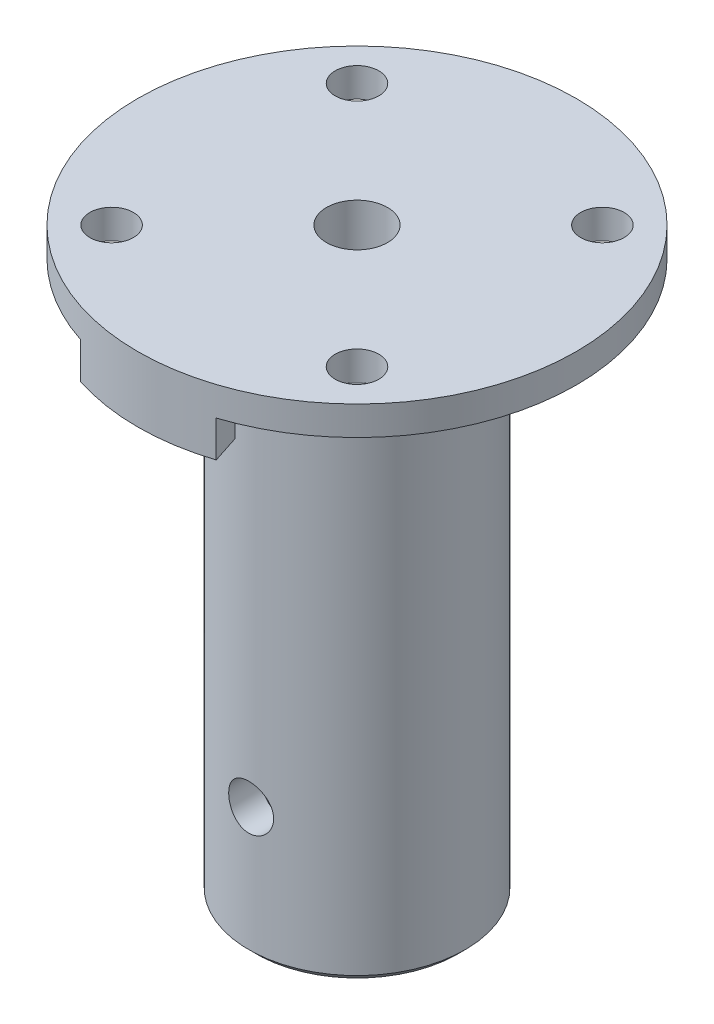
ISO-10303-21;
HEADER;
FILE_DESCRIPTION(('STEP AP214'),'2;1');
FILE_NAME('part.step','',(''),(''),'','','');
FILE_SCHEMA(('AUTOMOTIVE_DESIGN { 1 0 10303 214 1 1 1 1 }'));
ENDSEC;
DATA;
#1=APPLICATION_CONTEXT('core data for automotive mechanical design processes');
#2=APPLICATION_PROTOCOL_DEFINITION('international standard','automotive_design',2000,#1);
#3=PRODUCT_CONTEXT('',#1,'mechanical');
#4=PRODUCT('Part','Part','',(#3));
#5=PRODUCT_RELATED_PRODUCT_CATEGORY('part','',(#4));
#6=PRODUCT_DEFINITION_FORMATION('','',#4);
#7=PRODUCT_DEFINITION_CONTEXT('part definition',#1,'design');
#8=PRODUCT_DEFINITION('design','',#6,#7);
#9=PRODUCT_DEFINITION_SHAPE('','',#8);
#10=(LENGTH_UNIT() NAMED_UNIT(*) SI_UNIT(.MILLI.,.METRE.));
#11=(NAMED_UNIT(*) PLANE_ANGLE_UNIT() SI_UNIT($,.RADIAN.));
#12=(NAMED_UNIT(*) SI_UNIT($,.STERADIAN.) SOLID_ANGLE_UNIT());
#13=UNCERTAINTY_MEASURE_WITH_UNIT(LENGTH_MEASURE(1.E-05),#10,'distance_accuracy_value','');
#14=(GEOMETRIC_REPRESENTATION_CONTEXT(3) GLOBAL_UNCERTAINTY_ASSIGNED_CONTEXT((#13)) GLOBAL_UNIT_ASSIGNED_CONTEXT((#10,
#11,#12)) REPRESENTATION_CONTEXT('',''));
#15=CARTESIAN_POINT('',(0.,0.,0.));
#16=DIRECTION('',(0.,0.,1.));
#17=DIRECTION('',(1.,0.,0.));
#18=AXIS2_PLACEMENT_3D('',#15,#16,#17);
#19=CARTESIAN_POINT('',(-8.44992603517925,29.1,8.44992603517924));
#20=DIRECTION('',(0.,-1.,0.));
#21=DIRECTION('',(0.,0.,-1.));
#22=AXIS2_PLACEMENT_3D('',#19,#20,#21);
#23=CYLINDRICAL_SURFACE('',#22,1.5);
#24=CARTESIAN_POINT('',(-8.44992603517925,15.1,8.44992603517924));
#25=DIRECTION('',(0.,1.,0.));
#26=DIRECTION('',(0.,0.,1.));
#27=AXIS2_PLACEMENT_3D('',#24,#25,#26);
#28=CIRCLE('',#27,1.5);
#29=CARTESIAN_POINT('',(-8.44992603517925,15.1,9.94992603517924));
#30=VERTEX_POINT('',#29);
#31=EDGE_CURVE('E128',#30,#30,#28,.T.);
#32=ORIENTED_EDGE('',*,*,#31,.T.);
#33=EDGE_LOOP('',(#32));
#34=FACE_BOUND('',#33,.T.);
#35=CARTESIAN_POINT('',(-8.44992603517925,13.1,8.44992603517924));
#36=DIRECTION('',(0.,1.,0.));
#37=DIRECTION('',(0.,0.,1.));
#38=AXIS2_PLACEMENT_3D('',#35,#36,#37);
#39=CIRCLE('',#38,1.5);
#40=CARTESIAN_POINT('',(-7.38926586339942,13.1,7.38926586339942));
#41=VERTEX_POINT('',#40);
#42=EDGE_CURVE('E195',#41,#41,#39,.T.);
#43=ORIENTED_EDGE('',*,*,#42,.F.);
#44=EDGE_LOOP('',(#43));
#45=FACE_BOUND('',#44,.T.);
#46=ADVANCED_FACE('F36',(#34,#45),#23,.F.);
#47=CARTESIAN_POINT('',(-8.44992603517925,29.1,-8.44992603517925));
#48=DIRECTION('',(0.,-1.,0.));
#49=DIRECTION('',(0.,0.,-1.));
#50=AXIS2_PLACEMENT_3D('',#47,#48,#49);
#51=CYLINDRICAL_SURFACE('',#50,1.5);
#52=CARTESIAN_POINT('',(-8.44992603517925,15.1,-8.44992603517925));
#53=DIRECTION('',(0.,1.,0.));
#54=DIRECTION('',(0.,0.,1.));
#55=AXIS2_PLACEMENT_3D('',#52,#53,#54);
#56=CIRCLE('',#55,1.5);
#57=CARTESIAN_POINT('',(-8.44992603517925,15.1,-6.94992603517925));
#58=VERTEX_POINT('',#57);
#59=EDGE_CURVE('E113',#58,#58,#56,.T.);
#60=ORIENTED_EDGE('',*,*,#59,.T.);
#61=EDGE_LOOP('',(#60));
#62=FACE_BOUND('',#61,.T.);
#63=CARTESIAN_POINT('',(-8.44992603517925,13.1,-8.44992603517925));
#64=DIRECTION('',(0.,1.,0.));
#65=DIRECTION('',(0.,0.,1.));
#66=AXIS2_PLACEMENT_3D('',#63,#64,#65);
#67=CIRCLE('',#66,1.5);
#68=CARTESIAN_POINT('',(-7.38926586339942,13.1,-7.38926586339942));
#69=VERTEX_POINT('',#68);
#70=EDGE_CURVE('E49',#69,#69,#67,.T.);
#71=ORIENTED_EDGE('',*,*,#70,.F.);
#72=EDGE_LOOP('',(#71));
#73=FACE_BOUND('',#72,.T.);
#74=ADVANCED_FACE('F223',(#62,#73),#51,.F.);
#75=CARTESIAN_POINT('',(8.44992603517925,29.1,-8.44992603517924));
#76=DIRECTION('',(0.,-1.,0.));
#77=DIRECTION('',(0.,0.,-1.));
#78=AXIS2_PLACEMENT_3D('',#75,#76,#77);
#79=CYLINDRICAL_SURFACE('',#78,1.5);
#80=CARTESIAN_POINT('',(8.44992603517925,15.1,-8.44992603517924));
#81=DIRECTION('',(0.,1.,0.));
#82=DIRECTION('',(0.,0.,1.));
#83=AXIS2_PLACEMENT_3D('',#80,#81,#82);
#84=CIRCLE('',#83,1.5);
#85=CARTESIAN_POINT('',(8.44992603517925,15.1,-6.94992603517924));
#86=VERTEX_POINT('',#85);
#87=EDGE_CURVE('E117',#86,#86,#84,.T.);
#88=ORIENTED_EDGE('',*,*,#87,.T.);
#89=EDGE_LOOP('',(#88));
#90=FACE_BOUND('',#89,.T.);
#91=CARTESIAN_POINT('',(8.44992603517925,13.1,-8.44992603517924));
#92=DIRECTION('',(0.,1.,0.));
#93=DIRECTION('',(0.,0.,1.));
#94=AXIS2_PLACEMENT_3D('',#91,#92,#93);
#95=CIRCLE('',#94,1.5);
#96=CARTESIAN_POINT('',(7.38926586339942,13.1,-7.38926586339942));
#97=VERTEX_POINT('',#96);
#98=EDGE_CURVE('E202',#97,#97,#95,.T.);
#99=ORIENTED_EDGE('',*,*,#98,.F.);
#100=EDGE_LOOP('',(#99));
#101=FACE_BOUND('',#100,.T.);
#102=ADVANCED_FACE('F229',(#90,#101),#79,.F.);
#103=CARTESIAN_POINT('',(8.44992603517925,29.1,8.44992603517925));
#104=DIRECTION('',(0.,-1.,0.));
#105=DIRECTION('',(0.,0.,-1.));
#106=AXIS2_PLACEMENT_3D('',#103,#104,#105);
#107=CYLINDRICAL_SURFACE('',#106,1.5);
#108=CARTESIAN_POINT('',(8.44992603517925,15.1,8.44992603517925));
#109=DIRECTION('',(0.,1.,0.));
#110=DIRECTION('',(0.,0.,1.));
#111=AXIS2_PLACEMENT_3D('',#108,#109,#110);
#112=CIRCLE('',#111,1.5);
#113=CARTESIAN_POINT('',(8.44992603517925,15.1,9.94992603517925));
#114=VERTEX_POINT('',#113);
#115=EDGE_CURVE('E125',#114,#114,#112,.T.);
#116=ORIENTED_EDGE('',*,*,#115,.T.);
#117=EDGE_LOOP('',(#116));
#118=FACE_BOUND('',#117,.T.);
#119=CARTESIAN_POINT('',(8.44992603517925,13.1,8.44992603517925));
#120=DIRECTION('',(0.,1.,0.));
#121=DIRECTION('',(0.,0.,1.));
#122=AXIS2_PLACEMENT_3D('',#119,#120,#121);
#123=CIRCLE('',#122,1.5);
#124=CARTESIAN_POINT('',(7.38926586339942,13.1,7.38926586339942));
#125=VERTEX_POINT('',#124);
#126=EDGE_CURVE('E204',#125,#125,#123,.T.);
#127=ORIENTED_EDGE('',*,*,#126,.F.);
#128=EDGE_LOOP('',(#127));
#129=FACE_BOUND('',#128,.T.);
#130=ADVANCED_FACE('F256',(#118,#129),#107,.F.);
#131=CARTESIAN_POINT('',(0.,0.,0.));
#132=DIRECTION('',(0.,-1.,0.));
#133=DIRECTION('',(0.,0.,-1.));
#134=AXIS2_PLACEMENT_3D('',#131,#132,#133);
#135=CYLINDRICAL_SURFACE('',#134,5.3);
#136=CARTESIAN_POINT('',(0.,-24.9,0.));
#137=DIRECTION('',(0.,-1.,0.));
#138=DIRECTION('',(0.,0.,-1.));
#139=AXIS2_PLACEMENT_3D('',#136,#137,#138);
#140=CIRCLE('',#139,5.3);
#141=CARTESIAN_POINT('',(0.,-24.9,-5.3));
#142=VERTEX_POINT('',#141);
#143=EDGE_CURVE('E192',#142,#142,#140,.T.);
#144=ORIENTED_EDGE('',*,*,#143,.T.);
#145=EDGE_LOOP('',(#144));
#146=FACE_BOUND('',#145,.T.);
#147=CARTESIAN_POINT('',(1.55,-15.9,5.06828373317832));
#148=CARTESIAN_POINT('',(1.54999868093535,-15.9850416214658,5.06828478860766));
#149=CARTESIAN_POINT('',(1.54297739822915,-16.070096406709,5.07044754539419));
#150=CARTESIAN_POINT('',(1.51514554711468,-16.2377264512419,5.07883243135354));
#151=CARTESIAN_POINT('',(1.49432984091685,-16.3203007746904,5.08505607300626));
#152=CARTESIAN_POINT('',(1.439670649361,-16.4805194572717,5.1007988811338));
#153=CARTESIAN_POINT('',(1.40584803089862,-16.5581714819683,5.11031276664473));
#154=CARTESIAN_POINT('',(1.32620299952953,-16.7067166257225,5.13155704148212));
#155=CARTESIAN_POINT('',(1.28037898655205,-16.7776088418167,5.14328772630244));
#156=CARTESIAN_POINT('',(1.17655686310807,-16.9127539381314,5.16803943859624));
#157=CARTESIAN_POINT('',(1.11826122358157,-16.9767734584502,5.18108690449554));
#158=CARTESIAN_POINT('',(0.991788803127508,-17.0942811170859,5.20677567083136));
#159=CARTESIAN_POINT('',(0.923610815128268,-17.147767967013,5.21941692142027));
#160=CARTESIAN_POINT('',(0.777658814943683,-17.2436957887286,5.24316800550296));
#161=CARTESIAN_POINT('',(0.699723180449447,-17.2859002232252,5.2542430455204));
#162=CARTESIAN_POINT('',(0.537482421337177,-17.3565146480879,5.27330758628514));
#163=CARTESIAN_POINT('',(0.45317860293537,-17.3849274585057,5.28129771775276));
#164=CARTESIAN_POINT('',(0.283034693085939,-17.4263838583679,5.29310513274982));
#165=CARTESIAN_POINT('',(0.197299198119263,-17.4398254586823,5.29703027376742));
#166=CARTESIAN_POINT('',(0.0247061360897864,-17.4522149085951,5.30064464264608));
#167=CARTESIAN_POINT('',(-0.062151203147039,-17.4511656561823,5.30033471746734));
#168=CARTESIAN_POINT('',(-0.231735356957427,-17.4348734484417,5.29559077518486));
#169=CARTESIAN_POINT('',(-0.314507604782813,-17.4200612583557,5.29128192494402));
#170=CARTESIAN_POINT('',(-0.476335649948035,-17.3773654624596,5.2791753474609));
#171=CARTESIAN_POINT('',(-0.555391216313013,-17.3494810454484,5.27137740370319));
#172=CARTESIAN_POINT('',(-0.708583503914864,-17.2811317548456,5.25299282854183));
#173=CARTESIAN_POINT('',(-0.782654716828067,-17.2405285843609,5.24237574664419));
#174=CARTESIAN_POINT('',(-0.923072282479562,-17.1480029308856,5.21948333327733));
#175=CARTESIAN_POINT('',(-0.989416871002546,-17.0960778705183,5.20720762447163));
#176=CARTESIAN_POINT('',(-1.11506928115084,-16.9801355283517,5.18178384431656));
#177=CARTESIAN_POINT('',(-1.17402940493553,-16.9157443370366,5.16862029150781));
#178=CARTESIAN_POINT('',(-1.2804096573967,-16.7778577566921,5.14330139610834));
#179=CARTESIAN_POINT('',(-1.32782875455044,-16.7043615547534,5.13114614370223));
#180=CARTESIAN_POINT('',(-1.41011965574061,-16.5494744167563,5.10914871451326));
#181=CARTESIAN_POINT('',(-1.44487852661309,-16.4680202691353,5.099327615986));
#182=CARTESIAN_POINT('',(-1.50008611996066,-16.3000619762489,5.08336275794804));
#183=CARTESIAN_POINT('',(-1.52053923947208,-16.2135593915429,5.07721786859649));
#184=CARTESIAN_POINT('',(-1.54591688940864,-16.0412555929754,5.06954747557342));
#185=CARTESIAN_POINT('',(-1.55136764339393,-15.9555387795351,5.0678655094785));
#186=CARTESIAN_POINT('',(-1.54805075002207,-15.7844143797398,5.06887980755453));
#187=CARTESIAN_POINT('',(-1.53928497604769,-15.6990067541279,5.07157549486031));
#188=CARTESIAN_POINT('',(-1.50825145737365,-15.5330796724422,5.08088835389486));
#189=CARTESIAN_POINT('',(-1.48631719911301,-15.4524918549704,5.08740857996157));
#190=CARTESIAN_POINT('',(-1.42995323146397,-15.2961438996105,5.10353675316799));
#191=CARTESIAN_POINT('',(-1.39552165921976,-15.2203844834266,5.11314516060908));
#192=CARTESIAN_POINT('',(-1.31412598677512,-15.0736891545408,5.13467462872632));
#193=CARTESIAN_POINT('',(-1.26686221504163,-15.0029275093942,5.14664883363561));
#194=CARTESIAN_POINT('',(-1.16150327073052,-14.8701472017337,5.17144406504126));
#195=CARTESIAN_POINT('',(-1.10340563621799,-14.8081305321035,5.18426528358827));
#196=CARTESIAN_POINT('',(-0.975563448661122,-14.6923268002514,5.20986248943776));
#197=CARTESIAN_POINT('',(-0.905477826919032,-14.6389114257155,5.22262060860225));
#198=CARTESIAN_POINT('',(-0.757037044172609,-14.5445939147038,5.24619232818147));
#199=CARTESIAN_POINT('',(-0.678682307347954,-14.5036911367902,5.25700602826192));
#200=CARTESIAN_POINT('',(-0.516460213069248,-14.435953142154,5.27540275888225));
#201=CARTESIAN_POINT('',(-0.432640048530502,-14.4090118302251,5.2830100700635));
#202=CARTESIAN_POINT('',(-0.261401120963205,-14.3696793709866,5.29424415121962));
#203=CARTESIAN_POINT('',(-0.173983338452986,-14.3572842859822,5.29787199842654));
#204=CARTESIAN_POINT('',(-0.00147393582963898,-14.3476834058976,5.30067624170043));
#205=CARTESIAN_POINT('',(0.0835854211286531,-14.3499372388232,5.30001100830103));
#206=CARTESIAN_POINT('',(0.252062149850721,-14.3682871839851,5.29467354143044));
#207=CARTESIAN_POINT('',(0.335479606648822,-14.3843825774245,5.29000151603331));
#208=CARTESIAN_POINT('',(0.497516717331097,-14.4296305249903,5.27721749462026));
#209=CARTESIAN_POINT('',(0.576175250063577,-14.458654114607,5.26913951602396));
#210=CARTESIAN_POINT('',(0.727548705784286,-14.5288196458887,5.25038061800799));
#211=CARTESIAN_POINT('',(0.80026267857987,-14.5699635200693,5.23969928354383));
#212=CARTESIAN_POINT('',(0.940116448196518,-14.6646735294061,5.21645131823849));
#213=CARTESIAN_POINT('',(1.00701547808419,-14.7185833406987,5.20383674044624));
#214=CARTESIAN_POINT('',(1.1309988238074,-14.8366683780199,5.17830633550984));
#215=CARTESIAN_POINT('',(1.18808036571213,-14.900846495503,5.16539042439082));
#216=CARTESIAN_POINT('',(1.29240309443082,-15.0397967758648,5.1402975360994));
#217=CARTESIAN_POINT('',(1.33932529567882,-15.1148145593912,5.12815122982227));
#218=CARTESIAN_POINT('',(1.41983361198811,-15.2720180299664,5.10644901321439));
#219=CARTESIAN_POINT('',(1.45342670585944,-15.3541999384807,5.09689174815583));
#220=CARTESIAN_POINT('',(1.50296634124858,-15.5131402694026,5.08248698451609));
#221=CARTESIAN_POINT('',(1.52055714938504,-15.589350384502,5.07720931293604));
#222=CARTESIAN_POINT('',(1.54407355393076,-15.7437035232283,5.07010750750856));
#223=CARTESIAN_POINT('',(1.5500012122289,-15.8218462027298,5.06828276323197));
#224=CARTESIAN_POINT('',(1.55,-15.9,5.06828373317832));
#225=B_SPLINE_CURVE_WITH_KNOTS('',3,(#147,#148,#149,#150,#151,#152,#153,#154,#155,#156,#157,
#158,#159,#160,#161,#162,#163,#164,#165,#166,#167,#168,#169,#170,#171,#172,#173,#174,#175,#176,
#177,#178,#179,#180,#181,#182,#183,#184,#185,#186,#187,#188,#189,#190,#191,#192,#193,#194,#195,
#196,#197,#198,#199,#200,#201,#202,#203,#204,#205,#206,#207,#208,#209,#210,#211,#212,#213,#214,
#215,#216,#217,#218,#219,#220,#221,#222,#223,#224),.UNSPECIFIED.,.T.,.F.,(4,2,2,2,2,2,2,2,2,2,2,
2,2,2,2,2,2,2,2,2,2,2,2,2,2,2,2,2,2,2,2,2,2,2,2,2,2,2,4),(0.,0.25483679096692,0.509768550325881,
0.764293019273839,1.01885143966488,1.28034163442439,1.54186379565437,1.80850165260531,
2.07508496561106,2.33439813726166,2.59365945028366,2.84507000559885,3.09649616434007,
3.35075709136319,3.6050759602743,3.86873024612384,4.13240808842181,4.3983835275539,
4.66427718012519,4.92071772917175,5.17712448851416,5.42729665257895,5.6775061227549,
5.93415358542824,6.19085944103586,6.45670638425484,6.72253969698156,6.98632213428546,
7.25003314863559,7.50407298876948,7.75809963732742,8.00964711093586,8.26123471419663,
8.52057379130012,8.77998602469663,9.04663599514784,9.31314616907683,9.5473842334297,
9.78158088390404),.UNSPECIFIED.);
#226=CARTESIAN_POINT('',(1.55,-15.9,5.06828373317832));
#227=VERTEX_POINT('',#226);
#228=EDGE_CURVE('E149',#227,#227,#225,.T.);
#229=ORIENTED_EDGE('',*,*,#228,.F.);
#230=EDGE_LOOP('',(#229));
#231=FACE_BOUND('',#230,.T.);
#232=CARTESIAN_POINT('',(0.,-14.35,-5.3));
#233=CARTESIAN_POINT('',(-0.0851294851757954,-14.3500012894014,-5.29999911125248));
#234=CARTESIAN_POINT('',(-0.170272089179542,-14.3570365763843,-5.2979292076105));
#235=CARTESIAN_POINT('',(-0.338084098471153,-14.3849290893117,-5.28987386921162));
#236=CARTESIAN_POINT('',(-0.420752650581234,-14.405791027264,-5.28388709962832));
#237=CARTESIAN_POINT('',(-0.581171479442844,-14.4605852666367,-5.2686551550224));
#238=CARTESIAN_POINT('',(-0.658928615537051,-14.4944988480758,-5.25941464844424));
#239=CARTESIAN_POINT('',(-0.807652632066569,-14.5743586355071,-5.23863943059794));
#240=CARTESIAN_POINT('',(-0.878618709535754,-14.6203062619953,-5.22710444852915));
#241=CARTESIAN_POINT('',(-1.01369219490135,-14.724258186166,-5.20262049973162));
#242=CARTESIAN_POINT('',(-1.07758701022061,-14.7825321454261,-5.18964365410399));
#243=CARTESIAN_POINT('',(-1.19485066098684,-14.9089074378456,-5.16390776719562));
#244=CARTESIAN_POINT('',(-1.24821782999198,-14.9770103238956,-5.15114876068858));
#245=CARTESIAN_POINT('',(-1.34401037953203,-15.1228849302269,-5.12700060125315));
#246=CARTESIAN_POINT('',(-1.38617981507923,-15.2008310184137,-5.11564622272141));
#247=CARTESIAN_POINT('',(-1.45672677450663,-15.3630936906164,-5.09600800816372));
#248=CARTESIAN_POINT('',(-1.48510742517455,-15.4474088253521,-5.08772347611105));
#249=CARTESIAN_POINT('',(-1.52651123688221,-15.6176362779319,-5.0754528544205));
#250=CARTESIAN_POINT('',(-1.53992485198764,-15.703445560734,-5.07135772365896));
#251=CARTESIAN_POINT('',(-1.55223266016376,-15.876186742702,-5.06760484251904));
#252=CARTESIAN_POINT('',(-1.55113017580306,-15.9631183804229,-5.06794607670739));
#253=CARTESIAN_POINT('',(-1.53474453517352,-16.1324924053628,-5.07293050228428));
#254=CARTESIAN_POINT('',(-1.5199464852593,-16.2149867644134,-5.07742652020717));
#255=CARTESIAN_POINT('',(-1.47737193794073,-16.3762668424127,-5.08997640704209));
#256=CARTESIAN_POINT('',(-1.44959421713776,-16.4550522109998,-5.09803061132701));
#257=CARTESIAN_POINT('',(-1.38148273002179,-16.6078826866453,-5.11690959171184));
#258=CARTESIAN_POINT('',(-1.34098866538955,-16.6818518414272,-5.12776940585227));
#259=CARTESIAN_POINT('',(-1.24870545911906,-16.8221095264052,-5.15101867155629));
#260=CARTESIAN_POINT('',(-1.19691369821364,-16.8883962700386,-5.16340847754493));
#261=CARTESIAN_POINT('',(-1.08107919195879,-17.0141638993292,-5.18892232732197));
#262=CARTESIAN_POINT('',(-1.01663269636974,-17.073271577671,-5.20205602290599));
#263=CARTESIAN_POINT('',(-0.878578979266642,-17.1799248483305,-5.22714206248797));
#264=CARTESIAN_POINT('',(-0.804971237199841,-17.2274697831859,-5.23909433928704));
#265=CARTESIAN_POINT('',(-0.650030007297094,-17.309859504583,-5.26057096505782));
#266=CARTESIAN_POINT('',(-0.568652165169586,-17.344625116837,-5.27008007167076));
#267=CARTESIAN_POINT('',(-0.40086270442658,-17.399868204641,-5.28548911834957));
#268=CARTESIAN_POINT('',(-0.314452424029526,-17.4203494600384,-5.2913900131495));
#269=CARTESIAN_POINT('',(-0.142226543645309,-17.445829502959,-5.29876830639875));
#270=CARTESIAN_POINT('',(-0.0564919077678188,-17.4513344526143,-5.30039026275791));
#271=CARTESIAN_POINT('',(0.114679954283598,-17.4481193947156,-5.29945002622374));
#272=CARTESIAN_POINT('',(0.200117216639495,-17.4394011830019,-5.29688836156137));
#273=CARTESIAN_POINT('',(0.366383158692058,-17.4083981050024,-5.28796308779076));
#274=CARTESIAN_POINT('',(0.447271216130523,-17.3864058331388,-5.2816815295092));
#275=CARTESIAN_POINT('',(0.604194419605858,-17.3298280425034,-5.26603955227653));
#276=CARTESIAN_POINT('',(0.680228992256856,-17.2952410390267,-5.25667877034985));
#277=CARTESIAN_POINT('',(0.827174061009799,-17.2135851868916,-5.23559166815438));
#278=CARTESIAN_POINT('',(0.897931995965973,-17.1662545727772,-5.2238171409913));
#279=CARTESIAN_POINT('',(1.0306748839572,-17.0607756092116,-5.19925704597868));
#280=CARTESIAN_POINT('',(1.09265773966759,-17.0026246812661,-5.18647123755797));
#281=CARTESIAN_POINT('',(1.20829789796634,-16.874780313014,-5.16077997026985));
#282=CARTESIAN_POINT('',(1.26159562182712,-16.8047587246166,-5.14788551548133));
#283=CARTESIAN_POINT('',(1.35570546095839,-16.6564863031098,-5.12390766018288));
#284=CARTESIAN_POINT('',(1.39651796514569,-16.578235726437,-5.11282420326506));
#285=CARTESIAN_POINT('',(1.46420870202514,-16.4160185023033,-5.09385218455884));
#286=CARTESIAN_POINT('',(1.49115700765715,-16.3320830756861,-5.08594760119839));
#287=CARTESIAN_POINT('',(1.53046484772727,-16.1605938811288,-5.07425915642927));
#288=CARTESIAN_POINT('',(1.54282906913964,-16.0730412850276,-5.07047397117529));
#289=CARTESIAN_POINT('',(1.55231012729449,-15.9005252033429,-5.067578779405));
#290=CARTESIAN_POINT('',(1.55001106010871,-15.8155963907107,-5.06828966704341));
#291=CARTESIAN_POINT('',(1.53161577829491,-15.6473931808329,-5.07387854613471));
#292=CARTESIAN_POINT('',(1.5155200660042,-15.5641187234649,-5.07875638586841));
#293=CARTESIAN_POINT('',(1.47035688227804,-15.4024908070517,-5.09201246832427));
#294=CARTESIAN_POINT('',(1.44143677685401,-15.3240926642758,-5.10035087752857));
#295=CARTESIAN_POINT('',(1.37155998594944,-15.1731989210704,-5.11958303692433));
#296=CARTESIAN_POINT('',(1.33060108736612,-15.1007044090429,-5.13047725687853));
#297=CARTESIAN_POINT('',(1.23613840281354,-14.9609467461785,-5.15406700641265));
#298=CARTESIAN_POINT('',(1.18224752348764,-14.8939535826921,-5.16681204266341));
#299=CARTESIAN_POINT('',(1.06415662269565,-14.769771993672,-5.19241902961857));
#300=CARTESIAN_POINT('',(0.999953971632194,-14.7125860767892,-5.20528100935328));
#301=CARTESIAN_POINT('',(0.860949757570511,-14.6080908898576,-5.23009347037901));
#302=CARTESIAN_POINT('',(0.785906686684495,-14.5610938855277,-5.24200948022286));
#303=CARTESIAN_POINT('',(0.628635691801319,-14.4804518612026,-5.26318303970646));
#304=CARTESIAN_POINT('',(0.546411459260731,-14.44680002988,-5.27244194485409));
#305=CARTESIAN_POINT('',(0.387335221072355,-14.3971502560512,-5.28635627448317));
#306=CARTESIAN_POINT('',(0.311027541326172,-14.3795151332785,-5.29143160881343));
#307=CARTESIAN_POINT('',(0.156483409841969,-14.3559402820996,-5.29825363257209));
#308=CARTESIAN_POINT('',(0.0782472466228246,-14.3499988148394,-5.3000008168973));
#309=CARTESIAN_POINT('',(0.,-14.35,-5.3));
#310=B_SPLINE_CURVE_WITH_KNOTS('',3,(#232,#233,#234,#235,#236,#237,#238,#239,#240,#241,#242,
#243,#244,#245,#246,#247,#248,#249,#250,#251,#252,#253,#254,#255,#256,#257,#258,#259,#260,#261,
#262,#263,#264,#265,#266,#267,#268,#269,#270,#271,#272,#273,#274,#275,#276,#277,#278,#279,#280,
#281,#282,#283,#284,#285,#286,#287,#288,#289,#290,#291,#292,#293,#294,#295,#296,#297,#298,#299,
#300,#301,#302,#303,#304,#305,#306,#307,#308,#309),.UNSPECIFIED.,.T.,.F.,(4,2,2,2,2,2,2,2,2,2,2,
2,2,2,2,2,2,2,2,2,2,2,2,2,2,2,2,2,2,2,2,2,2,2,2,2,2,2,4),(0.,0.255101147346054,
0.510289275773716,0.765112743649101,1.01996630439486,1.28111198759829,1.54229897495359,
1.80902300245304,2.0756865185209,2.33521776154072,2.59468960186955,2.84530865714849,
3.09595133928797,3.3498897546788,3.60388710605075,3.86793742410413,4.13200275266133,
4.39767757203965,4.66328206331713,4.91979123443052,5.17626802077273,5.42728793666961,
5.67833745313377,5.93499960681356,6.19172300191736,6.45727424911341,6.72281722349857,
6.98700455975488,7.25110696939614,7.5047566853504,7.75839716628381,8.00919567029308,
8.26004030769552,8.51961780967697,8.77926161173412,9.04599395261331,9.31258997852533,
9.54710251225847,9.78158017119101),.UNSPECIFIED.);
#311=CARTESIAN_POINT('',(0.,-14.35,-5.3));
#312=VERTEX_POINT('',#311);
#313=EDGE_CURVE('E156',#312,#312,#310,.T.);
#314=ORIENTED_EDGE('',*,*,#313,.F.);
#315=EDGE_LOOP('',(#314));
#316=FACE_BOUND('',#315,.T.);
#317=CARTESIAN_POINT('',(0.,12.1,0.));
#318=DIRECTION('',(0.,1.,0.));
#319=DIRECTION('',(0.,0.,1.));
#320=AXIS2_PLACEMENT_3D('',#317,#318,#319);
#321=CIRCLE('',#320,5.3);
#322=CARTESIAN_POINT('',(0.,12.1,5.3));
#323=VERTEX_POINT('',#322);
#324=EDGE_CURVE('E135',#323,#323,#321,.T.);
#325=ORIENTED_EDGE('',*,*,#324,.T.);
#326=EDGE_LOOP('',(#325));
#327=FACE_BOUND('',#326,.T.);
#328=ADVANCED_FACE('F161',(#146,#231,#316,#327),#135,.F.);
#329=CARTESIAN_POINT('',(0.,0.,0.));
#330=DIRECTION('',(0.,-1.,0.));
#331=DIRECTION('',(0.,0.,-1.));
#332=AXIS2_PLACEMENT_3D('',#329,#330,#331);
#333=CYLINDRICAL_SURFACE('',#332,10.45);
#334=CARTESIAN_POINT('',(0.,10.1,0.));
#335=DIRECTION('',(0.,-1.,0.));
#336=DIRECTION('',(0.,0.,-1.));
#337=AXIS2_PLACEMENT_3D('',#334,#335,#336);
#338=CIRCLE('',#337,10.45);
#339=CARTESIAN_POINT('',(0.,10.1,-10.45));
#340=VERTEX_POINT('',#339);
#341=EDGE_CURVE('E417',#340,#340,#338,.T.);
#342=ORIENTED_EDGE('',*,*,#341,.F.);
#343=EDGE_LOOP('',(#342));
#344=FACE_BOUND('',#343,.T.);
#345=CARTESIAN_POINT('',(0.,13.1,0.));
#346=DIRECTION('',(0.,1.,0.));
#347=DIRECTION('',(0.,0.,1.));
#348=AXIS2_PLACEMENT_3D('',#345,#346,#347);
#349=CIRCLE('',#348,10.45);
#350=EDGE_CURVE('E56',#125,#41,#349,.F.);
#351=ORIENTED_EDGE('',*,*,#350,.T.);
#352=EDGE_CURVE('E196',#41,#69,#349,.F.);
#353=ORIENTED_EDGE('',*,*,#352,.T.);
#354=EDGE_CURVE('E198',#69,#97,#349,.F.);
#355=ORIENTED_EDGE('',*,*,#354,.T.);
#356=EDGE_CURVE('E252',#97,#125,#349,.F.);
#357=ORIENTED_EDGE('',*,*,#356,.T.);
#358=EDGE_LOOP('',(#351,#353,#355,#357));
#359=FACE_BOUND('',#358,.T.);
#360=ADVANCED_FACE('F250',(#344,#359),#333,.T.);
#361=CARTESIAN_POINT('',(7.45,-24.9,0.));
#362=DIRECTION('',(0.,-1.,0.));
#363=DIRECTION('',(0.,0.,-1.));
#364=AXIS2_PLACEMENT_3D('',#361,#362,#363);
#365=PLANE('',#364);
#366=CARTESIAN_POINT('',(0.,-24.9,0.));
#367=DIRECTION('',(0.,-1.,0.));
#368=DIRECTION('',(0.,0.,-1.));
#369=AXIS2_PLACEMENT_3D('',#366,#367,#368);
#370=CIRCLE('',#369,6.95000000000001);
#371=CARTESIAN_POINT('',(0.,-24.9,-6.95000000000001));
#372=VERTEX_POINT('',#371);
#373=EDGE_CURVE('E188',#372,#372,#370,.T.);
#374=ORIENTED_EDGE('',*,*,#373,.T.);
#375=EDGE_LOOP('',(#374));
#376=FACE_BOUND('',#375,.T.);
#377=ORIENTED_EDGE('',*,*,#143,.F.);
#378=EDGE_LOOP('',(#377));
#379=FACE_BOUND('',#378,.T.);
#380=ADVANCED_FACE('F328',(#376,#379),#365,.T.);
#381=CARTESIAN_POINT('',(5.3,15.1,0.));
#382=DIRECTION('',(0.,1.,0.));
#383=DIRECTION('',(0.,0.,1.));
#384=AXIS2_PLACEMENT_3D('',#381,#382,#383);
#385=PLANE('',#384);
#386=ORIENTED_EDGE('',*,*,#115,.F.);
#387=EDGE_LOOP('',(#386));
#388=FACE_BOUND('',#387,.T.);
#389=ORIENTED_EDGE('',*,*,#87,.F.);
#390=EDGE_LOOP('',(#389));
#391=FACE_BOUND('',#390,.T.);
#392=ORIENTED_EDGE('',*,*,#59,.F.);
#393=EDGE_LOOP('',(#392));
#394=FACE_BOUND('',#393,.T.);
#395=ORIENTED_EDGE('',*,*,#31,.F.);
#396=EDGE_LOOP('',(#395));
#397=FACE_BOUND('',#396,.T.);
#398=CARTESIAN_POINT('',(0.,15.1,0.));
#399=DIRECTION('',(0.,1.,0.));
#400=DIRECTION('',(0.,0.,1.));
#401=AXIS2_PLACEMENT_3D('',#398,#399,#400);
#402=CIRCLE('',#401,15.1);
#403=CARTESIAN_POINT('',(0.,15.1,15.1));
#404=VERTEX_POINT('',#403);
#405=EDGE_CURVE('E146',#404,#404,#402,.T.);
#406=ORIENTED_EDGE('',*,*,#405,.T.);
#407=EDGE_LOOP('',(#406));
#408=FACE_BOUND('',#407,.T.);
#409=CARTESIAN_POINT('',(0.,15.1,0.));
#410=DIRECTION('',(0.,1.,0.));
#411=DIRECTION('',(0.,0.,1.));
#412=AXIS2_PLACEMENT_3D('',#409,#410,#411);
#413=CIRCLE('',#412,2.1);
#414=CARTESIAN_POINT('',(0.,15.1,2.1));
#415=VERTEX_POINT('',#414);
#416=EDGE_CURVE('E131',#415,#415,#413,.T.);
#417=ORIENTED_EDGE('',*,*,#416,.F.);
#418=EDGE_LOOP('',(#417));
#419=FACE_BOUND('',#418,.T.);
#420=ADVANCED_FACE('F322',(#388,#391,#394,#397,#408,#419),#385,.T.);
#421=CARTESIAN_POINT('',(10.45,10.1,0.));
#422=DIRECTION('',(0.,-1.,0.));
#423=DIRECTION('',(0.,0.,-1.));
#424=AXIS2_PLACEMENT_3D('',#421,#422,#423);
#425=PLANE('',#424);
#426=ORIENTED_EDGE('',*,*,#341,.T.);
#427=EDGE_LOOP('',(#426));
#428=FACE_BOUND('',#427,.T.);
#429=CARTESIAN_POINT('',(0.,10.1,0.));
#430=DIRECTION('',(0.,-1.,0.));
#431=DIRECTION('',(0.,0.,-1.));
#432=AXIS2_PLACEMENT_3D('',#429,#430,#431);
#433=CIRCLE('',#432,7.45);
#434=CARTESIAN_POINT('',(0.,10.1,-7.45));
#435=VERTEX_POINT('',#434);
#436=EDGE_CURVE('E418',#435,#435,#433,.T.);
#437=ORIENTED_EDGE('',*,*,#436,.F.);
#438=EDGE_LOOP('',(#437));
#439=FACE_BOUND('',#438,.T.);
#440=ADVANCED_FACE('F327',(#428,#439),#425,.T.);
#441=CARTESIAN_POINT('',(0.,0.,0.));
#442=DIRECTION('',(0.,-1.,0.));
#443=DIRECTION('',(0.,0.,-1.));
#444=AXIS2_PLACEMENT_3D('',#441,#442,#443);
#445=CYLINDRICAL_SURFACE('',#444,7.45);
#446=CARTESIAN_POINT('',(0.,-24.4,0.));
#447=DIRECTION('',(0.,-1.,0.));
#448=DIRECTION('',(0.,0.,-1.));
#449=AXIS2_PLACEMENT_3D('',#446,#447,#448);
#450=CIRCLE('',#449,7.45);
#451=CARTESIAN_POINT('',(0.,-24.4,-7.45));
#452=VERTEX_POINT('',#451);
#453=EDGE_CURVE('E191',#452,#452,#450,.F.);
#454=ORIENTED_EDGE('',*,*,#453,.T.);
#455=EDGE_LOOP('',(#454));
#456=FACE_BOUND('',#455,.T.);
#457=CARTESIAN_POINT('',(0.,-14.35,-7.45));
#458=CARTESIAN_POINT('',(0.086069843172455,-14.3500030754852,-7.44999840695801));
#459=CARTESIAN_POINT('',(0.172177829981196,-14.3571932656024,-7.44849320755678));
#460=CARTESIAN_POINT('',(0.341954863343256,-14.3857382713825,-7.4426339357851));
#461=CARTESIAN_POINT('',(0.42562200343883,-14.4071038652304,-7.43827769567678));
#462=CARTESIAN_POINT('',(0.588038553349733,-14.4633070364216,-7.42720219151347));
#463=CARTESIAN_POINT('',(0.66679276342938,-14.4981312165592,-7.42048527796623));
#464=CARTESIAN_POINT('',(0.817336316005193,-14.5802220621712,-7.40541641046753));
#465=CARTESIAN_POINT('',(0.889125973808661,-14.6274881640004,-7.39706453058789));
#466=CARTESIAN_POINT('',(1.024754805039,-14.7338520387785,-7.37950683517302));
#467=CARTESIAN_POINT('',(1.08847770757007,-14.7930964794379,-7.37029127929));
#468=CARTESIAN_POINT('',(1.20515679868698,-14.9214201828581,-7.35211479976996));
#469=CARTESIAN_POINT('',(1.25811209795785,-14.9905002571604,-7.34315389721772));
#470=CARTESIAN_POINT('',(1.35225527382357,-15.1373804604526,-7.32640582925093));
#471=CARTESIAN_POINT('',(1.39332133437575,-15.2152602211018,-7.31863117563043));
#472=CARTESIAN_POINT('',(1.46173950960967,-15.3770032274917,-7.30527485481075));
#473=CARTESIAN_POINT('',(1.4890930975737,-15.4608658293232,-7.2996929520341));
#474=CARTESIAN_POINT('',(1.52892953009166,-15.6309385976106,-7.29145297228381));
#475=CARTESIAN_POINT('',(1.54161716635399,-15.7170988059099,-7.28875467072057));
#476=CARTESIAN_POINT('',(1.55239792756827,-15.8903639276934,-7.28646644685119));
#477=CARTESIAN_POINT('',(1.55049267053552,-15.9774687353738,-7.28687617993565));
#478=CARTESIAN_POINT('',(1.53230697997166,-16.1486421050744,-7.2907212378562));
#479=CARTESIAN_POINT('',(1.5162626178189,-16.2327370313912,-7.29410687361178));
#480=CARTESIAN_POINT('',(1.4706273654527,-16.3970148760801,-7.30344388810776));
#481=CARTESIAN_POINT('',(1.44103578057631,-16.477197593612,-7.30939539841796));
#482=CARTESIAN_POINT('',(1.36892431355182,-16.6320482440161,-7.32324360616395));
#483=CARTESIAN_POINT('',(1.32631203934849,-16.7066718639746,-7.33115412569776));
#484=CARTESIAN_POINT('',(1.22943389261135,-16.8477974950459,-7.34802033110158));
#485=CARTESIAN_POINT('',(1.17516657566946,-16.9142984979199,-7.35697614645211));
#486=CARTESIAN_POINT('',(1.05526083820472,-17.0386521041075,-7.37513825022769));
#487=CARTESIAN_POINT('',(0.989421240934268,-17.0963106850543,-7.38434601662357));
#488=CARTESIAN_POINT('',(0.848905314951505,-17.1997973803001,-7.40181492784513));
#489=CARTESIAN_POINT('',(0.774228854356857,-17.2456253180049,-7.4100760585395));
#490=CARTESIAN_POINT('',(0.617934547079443,-17.3241907558948,-7.4247438276494));
#491=CARTESIAN_POINT('',(0.536304534740135,-17.3569047173825,-7.43114712574334));
#492=CARTESIAN_POINT('',(0.368543890764581,-17.4080993850569,-7.4413526416227));
#493=CARTESIAN_POINT('',(0.282413851602653,-17.4265819599329,-7.44515520089759));
#494=CARTESIAN_POINT('',(0.109764091444152,-17.4485113635327,-7.44968279536058));
#495=CARTESIAN_POINT('',(0.023279451389764,-17.4522235074992,-7.45046212904387));
#496=CARTESIAN_POINT('',(-0.149074214552024,-17.445223130889,-7.44900684396565));
#497=CARTESIAN_POINT('',(-0.234943277706309,-17.4345114910666,-7.44677240923282));
#498=CARTESIAN_POINT('',(-0.402762637809085,-17.399187875867,-7.43957474970156));
#499=CARTESIAN_POINT('',(-0.484743116031808,-17.3747133055123,-7.43463851170218));
#500=CARTESIAN_POINT('',(-0.643436086207373,-17.3127097130088,-7.42258907926582));
#501=CARTESIAN_POINT('',(-0.720148159363617,-17.2751796544867,-7.41547571200894));
#502=CARTESIAN_POINT('',(-0.867236539579098,-17.1875653702307,-7.39972630860354));
#503=CARTESIAN_POINT('',(-0.937516616143079,-17.1373230320008,-7.39107153542661));
#504=CARTESIAN_POINT('',(-1.06874346139585,-17.0259206079264,-7.37324085984238));
#505=CARTESIAN_POINT('',(-1.12968913953827,-16.9647592482075,-7.36406489671539));
#506=CARTESIAN_POINT('',(-1.24155169290417,-16.8320429211509,-7.34604108639725));
#507=CARTESIAN_POINT('',(-1.29228574283521,-16.7603325838865,-7.33720119099769));
#508=CARTESIAN_POINT('',(-1.38098993189325,-16.6092524463052,-7.3210250718425));
#509=CARTESIAN_POINT('',(-1.41896060180232,-16.5298829646806,-7.31368878556226));
#510=CARTESIAN_POINT('',(-1.48081720965425,-16.3661502855965,-7.30141602416463));
#511=CARTESIAN_POINT('',(-1.50477908024663,-16.2818167894113,-7.29646663729832));
#512=CARTESIAN_POINT('',(-1.53816514652548,-16.1102055357061,-7.28950232113737));
#513=CARTESIAN_POINT('',(-1.54759141545668,-16.0229281998874,-7.28748697335659));
#514=CARTESIAN_POINT('',(-1.55155708786154,-15.8497454983974,-7.28664348476984));
#515=CARTESIAN_POINT('',(-1.54638577716517,-15.7638469298358,-7.28775340817268));
#516=CARTESIAN_POINT('',(-1.52194501295307,-15.5941732488823,-7.29289630923809));
#517=CARTESIAN_POINT('',(-1.5026756939781,-15.5103981162338,-7.2969292590055));
#518=CARTESIAN_POINT('',(-1.45071952027284,-15.3475526497403,-7.30743504590248));
#519=CARTESIAN_POINT('',(-1.41807092893369,-15.2684696292847,-7.31390092082852));
#520=CARTESIAN_POINT('',(-1.34031737206777,-15.116859390866,-7.32854743960662));
#521=CARTESIAN_POINT('',(-1.29521125394172,-15.0443327803416,-7.33672824211087));
#522=CARTESIAN_POINT('',(-1.19284697277833,-14.9064596347446,-7.35407047264153));
#523=CARTESIAN_POINT('',(-1.13538103316098,-14.8412692517716,-7.36324713885256));
#524=CARTESIAN_POINT('',(-1.01035409978393,-14.7213615923797,-7.38144074307882));
#525=CARTESIAN_POINT('',(-0.942790785242782,-14.6666467302673,-7.39045764383922));
#526=CARTESIAN_POINT('',(-0.798552364510796,-14.5686456748633,-7.40743830787049));
#527=CARTESIAN_POINT('',(-0.721781443563925,-14.5254980875474,-7.4153887735121));
#528=CARTESIAN_POINT('',(-0.561931610570771,-14.4527859781829,-7.42920892533115));
#529=CARTESIAN_POINT('',(-0.478858294109258,-14.4232095676847,-7.43508043165835));
#530=CARTESIAN_POINT('',(-0.329700326332858,-14.3840169482743,-7.44297922871399));
#531=CARTESIAN_POINT('',(-0.264447839200326,-14.3712839955521,-7.44559623668861));
#532=CARTESIAN_POINT('',(-0.132804443702536,-14.354274490326,-7.44910720526841));
#533=CARTESIAN_POINT('',(-0.0664135772874496,-14.3499976268811,-7.45000122922982));
#534=CARTESIAN_POINT('',(0.,-14.35,-7.45));
#535=B_SPLINE_CURVE_WITH_KNOTS('',3,(#457,#458,#459,#460,#461,#462,#463,#464,#465,#466,#467,
#468,#469,#470,#471,#472,#473,#474,#475,#476,#477,#478,#479,#480,#481,#482,#483,#484,#485,#486,
#487,#488,#489,#490,#491,#492,#493,#494,#495,#496,#497,#498,#499,#500,#501,#502,#503,#504,#505,
#506,#507,#508,#509,#510,#511,#512,#513,#514,#515,#516,#517,#518,#519,#520,#521,#522,#523,#524,
#525,#526,#527,#528,#529,#530,#531,#532,#533,#534),.UNSPECIFIED.,.T.,.F.,(4,2,2,2,2,2,2,2,2,2,2,
2,2,2,2,2,2,2,2,2,2,2,2,2,2,2,2,2,2,2,2,2,2,2,2,2,2,2,4),(0.,0.257966511041361,
0.516129390533633,0.774035943731892,1.03193081523078,1.29319885524593,1.55448846508313,
1.81836745994074,2.08221809728539,2.3423381025687,2.60242926696027,2.85825843029983,
3.11410071329892,3.37180230103011,3.62953584413625,3.89229729055237,4.15506265894434,
4.41829758389619,4.68149793820146,4.93994859414749,5.19838346912761,5.45428288032168,
5.7102026100091,5.9694769548485,6.22878156787985,6.49238101783801,6.75596950430755,
7.01811567423036,7.28022445021059,7.5371755911515,7.79412427997616,8.05034319328634,
8.30658582051106,8.56752988479162,8.8285340169759,9.09253846732712,9.35631120425281,
9.55537173700722,9.75442494992282),.UNSPECIFIED.);
#536=CARTESIAN_POINT('',(0.,-14.35,-7.45));
#537=VERTEX_POINT('',#536);
#538=EDGE_CURVE('E157',#537,#537,#535,.T.);
#539=ORIENTED_EDGE('',*,*,#538,.F.);
#540=EDGE_LOOP('',(#539));
#541=FACE_BOUND('',#540,.T.);
#542=CARTESIAN_POINT('',(1.55,-15.9,7.28697468089467));
#543=CARTESIAN_POINT('',(1.54999690753225,-15.8139528839895,7.28697641024848));
#544=CARTESIAN_POINT('',(1.54281038541197,-15.7278675803447,7.2885153754633));
#545=CARTESIAN_POINT('',(1.51428126848668,-15.5581376396621,7.29449496559745));
#546=CARTESIAN_POINT('',(1.49292780620867,-15.4744949278038,7.29893781805256));
#547=CARTESIAN_POINT('',(1.43676009960222,-15.3121301244695,7.31020071872286));
#548=CARTESIAN_POINT('',(1.40195982174564,-15.233403025643,7.31701829971581));
#549=CARTESIAN_POINT('',(1.31992532749752,-15.0829052158833,7.33225954036899));
#550=CARTESIAN_POINT('',(1.27269162015341,-15.011134220319,7.3406831342722));
#551=CARTESIAN_POINT('',(1.16636102288,-14.8754856372043,7.35833120437703));
#552=CARTESIAN_POINT('',(1.10711018678398,-14.8117299268088,7.36756508705636));
#553=CARTESIAN_POINT('',(0.9787597478551,-14.6949871390835,7.38571070572031));
#554=CARTESIAN_POINT('',(0.909659424419034,-14.6420008503495,7.39462241807461));
#555=CARTESIAN_POINT('',(0.762760173456269,-14.5478241870159,7.41122146232632));
#556=CARTESIAN_POINT('',(0.684885093780215,-14.5067502254211,7.41889640515472));
#557=CARTESIAN_POINT('',(0.523152200676517,-14.4383161684116,7.43205123796571));
#558=CARTESIAN_POINT('',(0.43929499475642,-14.4109546827015,7.43753135046883));
#559=CARTESIAN_POINT('',(0.269244143417803,-14.3711033270989,7.44561260025841));
#560=CARTESIAN_POINT('',(0.183100701242604,-14.3584074485666,7.44825358139043));
#561=CARTESIAN_POINT('',(0.00986880734992255,-14.3476043857996,7.45049679471567));
#562=CARTESIAN_POINT('',(-0.0772195452066629,-14.3494956852628,7.45009934274671));
#563=CARTESIAN_POINT('',(-0.248451632902477,-14.3676582237671,7.44634116838293));
#564=CARTESIAN_POINT('',(-0.332620062453021,-14.3837074983249,7.44302618798184));
#565=CARTESIAN_POINT('',(-0.497042329121292,-14.4293776525208,7.43385723285742));
#566=CARTESIAN_POINT('',(-0.577296000589902,-14.458999105902,7.42800315079799));
#567=CARTESIAN_POINT('',(-0.732236696787814,-14.5311744841349,7.41433913309233));
#568=CARTESIAN_POINT('',(-0.806882581878125,-14.5738141805322,7.40651628807038));
#569=CARTESIAN_POINT('',(-0.948041335651647,-14.6707519924704,7.38977520836004));
#570=CARTESIAN_POINT('',(-1.01455319414207,-14.725051553787,7.38085683788971));
#571=CARTESIAN_POINT('',(-1.13887437946032,-14.8449815740529,7.36270960066643));
#572=CARTESIAN_POINT('',(-1.19649605717204,-14.9108063043996,7.35347804989488));
#573=CARTESIAN_POINT('',(-1.29991518652172,-15.0512788710343,7.33590352002021));
#574=CARTESIAN_POINT('',(-1.34571237618873,-15.1259269027488,7.3275605606062));
#575=CARTESIAN_POINT('',(-1.42425499564603,-15.282210748272,7.31270175971521));
#576=CARTESIAN_POINT('',(-1.45696792293978,-15.3638633591272,7.30619048004302));
#577=CARTESIAN_POINT('',(-1.50815373497333,-15.5316735103416,7.29579752059367));
#578=CARTESIAN_POINT('',(-1.52662864292878,-15.617830408785,7.29191546721423));
#579=CARTESIAN_POINT('',(-1.54852909354391,-15.7904968836682,7.28729592736407));
#580=CARTESIAN_POINT('',(-1.55222656015076,-15.876970489333,7.28650162977189));
#581=CARTESIAN_POINT('',(-1.54520077517718,-16.0492986773972,7.28799472269016));
#582=CARTESIAN_POINT('',(-1.53447841323357,-16.1351532976567,7.29028192308644));
#583=CARTESIAN_POINT('',(-1.4991524081662,-16.3028786954986,7.29762691243936));
#584=CARTESIAN_POINT('',(-1.47469593079831,-16.3847818735179,7.30265531206319));
#585=CARTESIAN_POINT('',(-1.4127541113737,-16.543328162894,7.31489004487336));
#586=CARTESIAN_POINT('',(-1.37526762183601,-16.6199708102729,7.32209656986783));
#587=CARTESIAN_POINT('',(-1.28772126519851,-16.7670048083762,7.33800200979274));
#588=CARTESIAN_POINT('',(-1.23749235568729,-16.8372933547504,7.34672044629621));
#589=CARTESIAN_POINT('',(-1.12611055689829,-16.9685434461793,7.3646146825297));
#590=CARTESIAN_POINT('',(-1.0649564462566,-17.0295039470053,7.37379053331279));
#591=CARTESIAN_POINT('',(-0.932235334730946,-17.1414087494257,7.39175131013654));
#592=CARTESIAN_POINT('',(-0.860511330991198,-17.1921685446657,7.40052713510656));
#593=CARTESIAN_POINT('',(-0.709396002808052,-17.280917866843,7.41653704664352));
#594=CARTESIAN_POINT('',(-0.630005016794601,-17.3189079571193,7.42377120121652));
#595=CARTESIAN_POINT('',(-0.466277753481823,-17.3807755397313,7.43584401621198));
#596=CARTESIAN_POINT('',(-0.381974392375777,-17.4047372336969,7.44069694024491));
#597=CARTESIAN_POINT('',(-0.210427518967425,-17.4381331178002,7.44752189136085));
#598=CARTESIAN_POINT('',(-0.123184392898858,-17.447569208802,7.44949429539569));
#599=CARTESIAN_POINT('',(0.0500077566801567,-17.451567419537,7.45032609918322));
#600=CARTESIAN_POINT('',(0.135950235909025,-17.4464061138307,7.4492433846827));
#601=CARTESIAN_POINT('',(0.305714425670988,-17.4219700571626,7.44420928173939));
#602=CARTESIAN_POINT('',(0.389536167478451,-17.4026955144534,7.44025793562566));
#603=CARTESIAN_POINT('',(0.552489635197959,-17.3507071725299,7.42993330056845));
#604=CARTESIAN_POINT('',(0.63163320570854,-17.318029137674,7.42356646022298));
#605=CARTESIAN_POINT('',(0.783352537325709,-17.2401977107402,7.40909396703462));
#606=CARTESIAN_POINT('',(0.855927727610955,-17.1950432357837,7.40098816327403));
#607=CARTESIAN_POINT('',(0.993810076367804,-17.0926207759376,7.38374963311298));
#608=CARTESIAN_POINT('',(1.05896938100375,-17.0351563147031,7.37460153674263));
#609=CARTESIAN_POINT('',(1.17881502695159,-16.9101457488475,7.35639710381075));
#610=CARTESIAN_POINT('',(1.23349886807443,-16.8425972442859,7.34734078964222));
#611=CARTESIAN_POINT('',(1.33146027479157,-16.6983753773701,7.33022662147924));
#612=CARTESIAN_POINT('',(1.37459512086385,-16.6216034440526,7.32218185913635));
#613=CARTESIAN_POINT('',(1.44728314251768,-16.4617527364528,7.3081634238886));
#614=CARTESIAN_POINT('',(1.47684829486464,-16.3786795994518,7.30218792577597));
#615=CARTESIAN_POINT('',(1.51601421182622,-16.2295502989938,7.29414073066748));
#616=CARTESIAN_POINT('',(1.52873540252365,-16.1643279757374,7.29147060516213));
#617=CARTESIAN_POINT('',(1.54572932031824,-16.0327446473825,7.28788694837027));
#618=CARTESIAN_POINT('',(1.55000238577914,-15.9663836879961,7.28697334673161));
#619=CARTESIAN_POINT('',(1.55,-15.9,7.28697468089467));
#620=B_SPLINE_CURVE_WITH_KNOTS('',3,(#542,#543,#544,#545,#546,#547,#548,#549,#550,#551,#552,
#553,#554,#555,#556,#557,#558,#559,#560,#561,#562,#563,#564,#565,#566,#567,#568,#569,#570,#571,
#572,#573,#574,#575,#576,#577,#578,#579,#580,#581,#582,#583,#584,#585,#586,#587,#588,#589,#590,
#591,#592,#593,#594,#595,#596,#597,#598,#599,#600,#601,#602,#603,#604,#605,#606,#607,#608,#609,
#610,#611,#612,#613,#614,#615,#616,#617,#618,#619),.UNSPECIFIED.,.T.,.F.,(4,2,2,2,2,2,2,2,2,2,2,
2,2,2,2,2,2,2,2,2,2,2,2,2,2,2,2,2,2,2,2,2,2,2,2,2,2,2,4),(0.,0.25789819235742,0.515994447754704,
0.773823350155093,1.03164169820827,1.29299913170168,1.55437569631897,1.81822655435516,
2.08205065537926,2.34212192374197,2.6021661586894,2.85820454399744,3.11425375393525,
3.37202776145539,3.62983375037666,3.89249876663144,4.15516960171745,4.4184889418865,
4.68177085760184,4.94018510512668,5.19858341041749,5.45426431748734,5.70996774666501,
5.96925906777571,6.22857939406972,6.49223541602967,6.7558798052062,7.01792507221061,
7.27993604426362,7.53701617531687,7.79409251301481,8.05048731415895,8.30690437579456,
8.56776782917082,8.82869346572112,9.09270853027273,9.3564901219033,9.55546156533775,
9.75442503941991),.UNSPECIFIED.);
#621=CARTESIAN_POINT('',(1.55,-15.9,7.28697468089467));
#622=VERTEX_POINT('',#621);
#623=EDGE_CURVE('E178',#622,#622,#620,.T.);
#624=ORIENTED_EDGE('',*,*,#623,.F.);
#625=EDGE_LOOP('',(#624));
#626=FACE_BOUND('',#625,.T.);
#627=ORIENTED_EDGE('',*,*,#436,.T.);
#628=EDGE_LOOP('',(#627));
#629=FACE_BOUND('',#628,.T.);
#630=ADVANCED_FACE('F170',(#456,#541,#626,#629),#445,.T.);
#631=CARTESIAN_POINT('',(0.,-15.9,-10.45));
#632=DIRECTION('',(0.,0.,1.));
#633=DIRECTION('',(1.,0.,0.));
#634=AXIS2_PLACEMENT_3D('',#631,#632,#633);
#635=CYLINDRICAL_SURFACE('',#634,1.55);
#636=ORIENTED_EDGE('',*,*,#228,.T.);
#637=EDGE_LOOP('',(#636));
#638=FACE_BOUND('',#637,.T.);
#639=ORIENTED_EDGE('',*,*,#623,.T.);
#640=EDGE_LOOP('',(#639));
#641=FACE_BOUND('',#640,.T.);
#642=ADVANCED_FACE('F164',(#638,#641),#635,.F.);
#643=ORIENTED_EDGE('',*,*,#313,.T.);
#644=EDGE_LOOP('',(#643));
#645=FACE_BOUND('',#644,.T.);
#646=ORIENTED_EDGE('',*,*,#538,.T.);
#647=EDGE_LOOP('',(#646));
#648=FACE_BOUND('',#647,.T.);
#649=ADVANCED_FACE('F169',(#645,#648),#635,.F.);
#650=CARTESIAN_POINT('',(0.,-24.9,0.));
#651=DIRECTION('',(0.,1.,0.));
#652=DIRECTION('',(0.,0.,1.));
#653=AXIS2_PLACEMENT_3D('',#650,#651,#652);
#654=CONICAL_SURFACE('',#653,6.95000000000001,0.785398163397441);
#655=ORIENTED_EDGE('',*,*,#453,.F.);
#656=EDGE_LOOP('',(#655));
#657=FACE_BOUND('',#656,.T.);
#658=ORIENTED_EDGE('',*,*,#373,.F.);
#659=EDGE_LOOP('',(#658));
#660=FACE_BOUND('',#659,.T.);
#661=ADVANCED_FACE('F38',(#657,#660),#654,.T.);
#662=CARTESIAN_POINT('',(0.,15.1,0.));
#663=DIRECTION('',(0.,1.,0.));
#664=DIRECTION('',(0.,0.,1.));
#665=AXIS2_PLACEMENT_3D('',#662,#663,#664);
#666=CYLINDRICAL_SURFACE('',#665,15.1);
#667=CARTESIAN_POINT('',(0.,10.6,0.));
#668=DIRECTION('',(0.,1.,0.));
#669=DIRECTION('',(0.,0.,1.));
#670=AXIS2_PLACEMENT_3D('',#667,#668,#669);
#671=CIRCLE('',#670,15.1);
#672=CARTESIAN_POINT('',(-4.66615661506172,10.6,14.3609533960568));
#673=VERTEX_POINT('',#672);
#674=CARTESIAN_POINT('',(4.66615661506172,10.6,14.3609533960568));
#675=VERTEX_POINT('',#674);
#676=EDGE_CURVE('E112',#673,#675,#671,.T.);
#677=ORIENTED_EDGE('',*,*,#676,.T.);
#678=DIRECTION('',(0.,1.,0.));
#679=VECTOR('',#678,1.);
#680=CARTESIAN_POINT('',(4.66615661506172,15.1,14.3609533960568));
#681=LINE('',#680,#679);
#682=CARTESIAN_POINT('',(4.66615661506172,13.1,14.3609533960568));
#683=VERTEX_POINT('',#682);
#684=EDGE_CURVE('E105',#675,#683,#681,.T.);
#685=ORIENTED_EDGE('',*,*,#684,.T.);
#686=CARTESIAN_POINT('',(0.,13.1,0.));
#687=DIRECTION('',(0.,-1.,0.));
#688=DIRECTION('',(0.,0.,-1.));
#689=AXIS2_PLACEMENT_3D('',#686,#687,#688);
#690=CIRCLE('',#689,15.1);
#691=CARTESIAN_POINT('',(-4.66615661506172,13.1,14.3609533960568));
#692=VERTEX_POINT('',#691);
#693=EDGE_CURVE('E91',#692,#683,#690,.T.);
#694=ORIENTED_EDGE('',*,*,#693,.F.);
#695=DIRECTION('',(0.,1.,0.));
#696=VECTOR('',#695,1.);
#697=CARTESIAN_POINT('',(-4.66615661506172,15.1,14.3609533960568));
#698=LINE('',#697,#696);
#699=EDGE_CURVE('E119',#692,#673,#698,.F.);
#700=ORIENTED_EDGE('',*,*,#699,.T.);
#701=EDGE_LOOP('',(#677,#685,#694,#700));
#702=FACE_BOUND('',#701,.T.);
#703=ORIENTED_EDGE('',*,*,#405,.F.);
#704=EDGE_LOOP('',(#703));
#705=FACE_BOUND('',#704,.T.);
#706=ADVANCED_FACE('F109',(#702,#705),#666,.T.);
#707=CARTESIAN_POINT('',(0.,10.6,-15.1));
#708=DIRECTION('',(0.,1.,0.));
#709=DIRECTION('',(0.,0.,1.));
#710=AXIS2_PLACEMENT_3D('',#707,#708,#709);
#711=PLANE('',#710);
#712=CARTESIAN_POINT('',(0.,10.6,0.));
#713=DIRECTION('',(0.,1.,0.));
#714=DIRECTION('',(0.,0.,1.));
#715=AXIS2_PLACEMENT_3D('',#712,#713,#714);
#716=CIRCLE('',#715,13.1);
#717=CARTESIAN_POINT('',(-4.04812262631182,10.6,12.4588403634665));
#718=VERTEX_POINT('',#717);
#719=CARTESIAN_POINT('',(4.04812262631182,10.6,12.4588403634665));
#720=VERTEX_POINT('',#719);
#721=EDGE_CURVE('E142',#718,#720,#716,.T.);
#722=ORIENTED_EDGE('',*,*,#721,.T.);
#723=DIRECTION('',(0.309016994374948,0.,0.951056516295153));
#724=VECTOR('',#723,1.);
#725=CARTESIAN_POINT('',(-4.43777865480818,10.6,-13.6580783075308));
#726=LINE('',#725,#724);
#727=EDGE_CURVE('E114',#720,#675,#726,.T.);
#728=ORIENTED_EDGE('',*,*,#727,.T.);
#729=ORIENTED_EDGE('',*,*,#676,.F.);
#730=DIRECTION('',(0.309016994374949,0.,-0.951056516295153));
#731=VECTOR('',#730,1.);
#732=CARTESIAN_POINT('',(4.43777865480818,10.6,-13.6580783075308));
#733=LINE('',#732,#731);
#734=EDGE_CURVE('E101',#673,#718,#733,.T.);
#735=ORIENTED_EDGE('',*,*,#734,.T.);
#736=EDGE_LOOP('',(#722,#728,#729,#735));
#737=FACE_BOUND('',#736,.T.);
#738=ADVANCED_FACE('F213',(#737),#711,.F.);
#739=CARTESIAN_POINT('',(0.,15.1,0.));
#740=DIRECTION('',(0.,1.,0.));
#741=DIRECTION('',(0.,0.,1.));
#742=AXIS2_PLACEMENT_3D('',#739,#740,#741);
#743=CYLINDRICAL_SURFACE('',#742,13.1);
#744=CARTESIAN_POINT('',(0.,13.1,0.));
#745=DIRECTION('',(0.,1.,0.));
#746=DIRECTION('',(0.,0.,1.));
#747=AXIS2_PLACEMENT_3D('',#744,#745,#746);
#748=CIRCLE('',#747,13.1);
#749=CARTESIAN_POINT('',(-4.04812262631182,13.1,12.4588403634665));
#750=VERTEX_POINT('',#749);
#751=CARTESIAN_POINT('',(4.04812262631182,13.1,12.4588403634665));
#752=VERTEX_POINT('',#751);
#753=EDGE_CURVE('E140',#750,#752,#748,.T.);
#754=ORIENTED_EDGE('',*,*,#753,.T.);
#755=DIRECTION('',(0.,1.,0.));
#756=VECTOR('',#755,1.);
#757=CARTESIAN_POINT('',(4.04812262631182,15.1,12.4588403634665));
#758=LINE('',#757,#756);
#759=EDGE_CURVE('E11',#752,#720,#758,.F.);
#760=ORIENTED_EDGE('',*,*,#759,.T.);
#761=ORIENTED_EDGE('',*,*,#721,.F.);
#762=DIRECTION('',(0.,1.,0.));
#763=VECTOR('',#762,1.);
#764=CARTESIAN_POINT('',(-4.04812262631182,15.1,12.4588403634665));
#765=LINE('',#764,#763);
#766=EDGE_CURVE('E44',#718,#750,#765,.T.);
#767=ORIENTED_EDGE('',*,*,#766,.T.);
#768=EDGE_LOOP('',(#754,#760,#761,#767));
#769=FACE_BOUND('',#768,.T.);
#770=ADVANCED_FACE('F208',(#769),#743,.F.);
#771=CARTESIAN_POINT('',(0.,13.1,-13.1));
#772=DIRECTION('',(0.,1.,0.));
#773=DIRECTION('',(0.,0.,1.));
#774=AXIS2_PLACEMENT_3D('',#771,#772,#773);
#775=PLANE('',#774);
#776=ORIENTED_EDGE('',*,*,#352,.F.);
#777=ORIENTED_EDGE('',*,*,#42,.T.);
#778=ORIENTED_EDGE('',*,*,#350,.F.);
#779=ORIENTED_EDGE('',*,*,#126,.T.);
#780=ORIENTED_EDGE('',*,*,#356,.F.);
#781=ORIENTED_EDGE('',*,*,#98,.T.);
#782=ORIENTED_EDGE('',*,*,#354,.F.);
#783=ORIENTED_EDGE('',*,*,#70,.T.);
#784=EDGE_LOOP('',(#776,#777,#778,#779,#780,#781,#782,#783));
#785=FACE_BOUND('',#784,.T.);
#786=DIRECTION('',(-0.309016994374948,0.,-0.951056516295153));
#787=VECTOR('',#786,1.);
#788=CARTESIAN_POINT('',(3.22922759121821,13.1,9.93854059528435));
#789=LINE('',#788,#787);
#790=EDGE_CURVE('E95',#683,#752,#789,.T.);
#791=ORIENTED_EDGE('',*,*,#790,.T.);
#792=ORIENTED_EDGE('',*,*,#753,.F.);
#793=DIRECTION('',(-0.309016994374948,0.,0.951056516295153));
#794=VECTOR('',#793,1.);
#795=CARTESIAN_POINT('',(-3.22922759121821,13.1,9.93854059528435));
#796=LINE('',#795,#794);
#797=EDGE_CURVE('E97',#750,#692,#796,.T.);
#798=ORIENTED_EDGE('',*,*,#797,.T.);
#799=ORIENTED_EDGE('',*,*,#693,.T.);
#800=EDGE_LOOP('',(#791,#792,#798,#799));
#801=FACE_BOUND('',#800,.T.);
#802=ADVANCED_FACE('F93',(#785,#801),#775,.F.);
#803=CARTESIAN_POINT('',(0.,12.1,0.));
#804=DIRECTION('',(0.,1.,0.));
#805=DIRECTION('',(0.,0.,1.));
#806=AXIS2_PLACEMENT_3D('',#803,#804,#805);
#807=PLANE('',#806);
#808=CARTESIAN_POINT('',(0.,12.1,0.));
#809=DIRECTION('',(0.,1.,0.));
#810=DIRECTION('',(0.,0.,1.));
#811=AXIS2_PLACEMENT_3D('',#808,#809,#810);
#812=CIRCLE('',#811,2.1);
#813=CARTESIAN_POINT('',(0.,12.1,2.1));
#814=VERTEX_POINT('',#813);
#815=EDGE_CURVE('E132',#814,#814,#812,.T.);
#816=ORIENTED_EDGE('',*,*,#815,.T.);
#817=EDGE_LOOP('',(#816));
#818=FACE_BOUND('',#817,.T.);
#819=ORIENTED_EDGE('',*,*,#324,.F.);
#820=EDGE_LOOP('',(#819));
#821=FACE_BOUND('',#820,.T.);
#822=ADVANCED_FACE('F238',(#818,#821),#807,.F.);
#823=CARTESIAN_POINT('',(0.,12.1,0.));
#824=DIRECTION('',(0.,1.,0.));
#825=DIRECTION('',(0.,0.,1.));
#826=AXIS2_PLACEMENT_3D('',#823,#824,#825);
#827=CYLINDRICAL_SURFACE('',#826,2.1);
#828=ORIENTED_EDGE('',*,*,#815,.F.);
#829=EDGE_LOOP('',(#828));
#830=FACE_BOUND('',#829,.T.);
#831=ORIENTED_EDGE('',*,*,#416,.T.);
#832=EDGE_LOOP('',(#831));
#833=FACE_BOUND('',#832,.T.);
#834=ADVANCED_FACE('F235',(#830,#833),#827,.F.);
#835=CARTESIAN_POINT('',(3.22922759121821,13.1,9.93854059528435));
#836=DIRECTION('',(-0.951056516295153,0.,0.309016994374948));
#837=DIRECTION('',(0.309016994374948,0.,0.951056516295153));
#838=AXIS2_PLACEMENT_3D('',#835,#836,#837);
#839=PLANE('',#838);
#840=ORIENTED_EDGE('',*,*,#727,.F.);
#841=ORIENTED_EDGE('',*,*,#759,.F.);
#842=ORIENTED_EDGE('',*,*,#790,.F.);
#843=ORIENTED_EDGE('',*,*,#684,.F.);
#844=EDGE_LOOP('',(#840,#841,#842,#843));
#845=FACE_BOUND('',#844,.T.);
#846=ADVANCED_FACE('F104',(#845),#839,.F.);
#847=CARTESIAN_POINT('',(-3.22922759121821,13.1,9.93854059528435));
#848=DIRECTION('',(0.951056516295153,0.,0.309016994374948));
#849=DIRECTION('',(0.309016994374949,0.,-0.951056516295153));
#850=AXIS2_PLACEMENT_3D('',#847,#848,#849);
#851=PLANE('',#850);
#852=ORIENTED_EDGE('',*,*,#797,.F.);
#853=ORIENTED_EDGE('',*,*,#766,.F.);
#854=ORIENTED_EDGE('',*,*,#734,.F.);
#855=ORIENTED_EDGE('',*,*,#699,.F.);
#856=EDGE_LOOP('',(#852,#853,#854,#855));
#857=FACE_BOUND('',#856,.T.);
#858=ADVANCED_FACE('F211',(#857),#851,.F.);
#859=CLOSED_SHELL('',(#46,#74,#102,#130,#328,#360,#380,#420,#440,#630,#642,#649,#661,#706,#738,
#770,#802,#822,#834,#846,#858));
#860=MANIFOLD_SOLID_BREP('B2',#859);
#861=ADVANCED_BREP_SHAPE_REPRESENTATION('',(#18,#860),#14);
#862=SHAPE_DEFINITION_REPRESENTATION(#9,#861);
ENDSEC;
END-ISO-10303-21;
